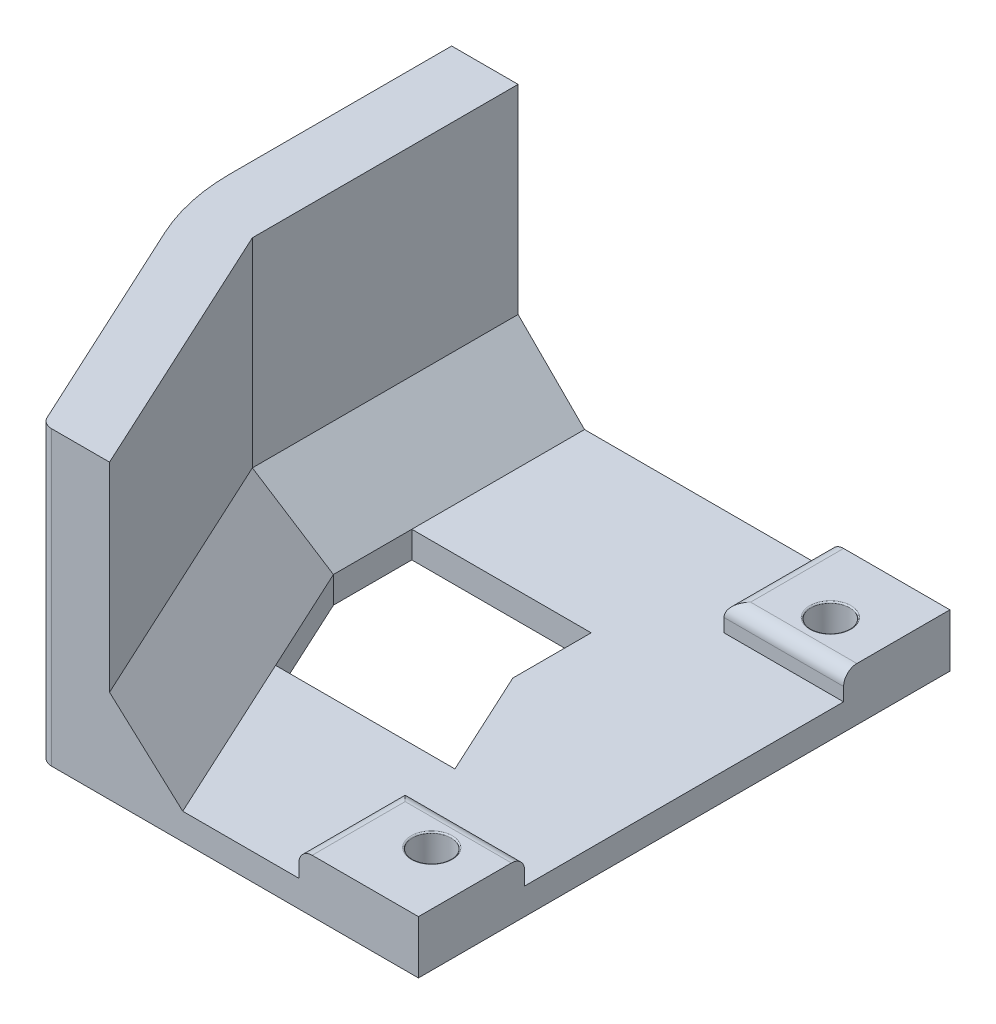
ISO-10303-21;
HEADER;
FILE_DESCRIPTION(('STEP AP214'),'2;1');
FILE_NAME('part.step','',(''),(''),'','','');
FILE_SCHEMA(('AUTOMOTIVE_DESIGN { 1 0 10303 214 1 1 1 1 }'));
ENDSEC;
DATA;
#1=APPLICATION_CONTEXT('core data for automotive mechanical design processes');
#2=APPLICATION_PROTOCOL_DEFINITION('international standard','automotive_design',2000,#1);
#3=PRODUCT_CONTEXT('',#1,'mechanical');
#4=PRODUCT('Part','Part','',(#3));
#5=PRODUCT_RELATED_PRODUCT_CATEGORY('part','',(#4));
#6=PRODUCT_DEFINITION_FORMATION('','',#4);
#7=PRODUCT_DEFINITION_CONTEXT('part definition',#1,'design');
#8=PRODUCT_DEFINITION('design','',#6,#7);
#9=PRODUCT_DEFINITION_SHAPE('','',#8);
#10=(LENGTH_UNIT() NAMED_UNIT(*) SI_UNIT(.MILLI.,.METRE.));
#11=(NAMED_UNIT(*) PLANE_ANGLE_UNIT() SI_UNIT($,.RADIAN.));
#12=(NAMED_UNIT(*) SI_UNIT($,.STERADIAN.) SOLID_ANGLE_UNIT());
#13=UNCERTAINTY_MEASURE_WITH_UNIT(LENGTH_MEASURE(1.E-05),#10,'distance_accuracy_value','');
#14=(GEOMETRIC_REPRESENTATION_CONTEXT(3) GLOBAL_UNCERTAINTY_ASSIGNED_CONTEXT((#13)) GLOBAL_UNIT_ASSIGNED_CONTEXT((#10,
#11,#12)) REPRESENTATION_CONTEXT('',''));
#15=CARTESIAN_POINT('',(0.,0.,0.));
#16=DIRECTION('',(0.,0.,1.));
#17=DIRECTION('',(1.,0.,0.));
#18=AXIS2_PLACEMENT_3D('',#15,#16,#17);
#19=CARTESIAN_POINT('',(0.,8.,0.));
#20=DIRECTION('',(0.,-1.,0.));
#21=DIRECTION('',(0.,0.,-1.));
#22=AXIS2_PLACEMENT_3D('',#19,#20,#21);
#23=PLANE('',#22);
#24=CARTESIAN_POINT('',(10.,8.,-70.));
#25=DIRECTION('',(0.,-1.,0.));
#26=DIRECTION('',(0.,0.,-1.));
#27=AXIS2_PLACEMENT_3D('',#24,#25,#26);
#28=CIRCLE('',#27,3.1);
#29=CARTESIAN_POINT('',(10.,8.,-73.1));
#30=VERTEX_POINT('',#29);
#31=EDGE_CURVE('E320',#30,#30,#28,.T.);
#32=ORIENTED_EDGE('',*,*,#31,.T.);
#33=EDGE_LOOP('',(#32));
#34=FACE_BOUND('',#33,.T.);
#35=DIRECTION('',(-1.,0.,0.));
#36=VECTOR('',#35,1.);
#37=CARTESIAN_POINT('',(20.,8.,-80.));
#38=LINE('',#37,#36);
#39=CARTESIAN_POINT('',(18.,8.,-80.));
#40=VERTEX_POINT('',#39);
#41=CARTESIAN_POINT('',(2.,8.,-80.));
#42=VERTEX_POINT('',#41);
#43=EDGE_CURVE('E400',#40,#42,#38,.T.);
#44=ORIENTED_EDGE('',*,*,#43,.T.);
#45=DIRECTION('',(0.,0.,1.));
#46=VECTOR('',#45,1.);
#47=CARTESIAN_POINT('',(2.00000000000001,8.,0.));
#48=LINE('',#47,#46);
#49=CARTESIAN_POINT('',(2.,8.,-66.));
#50=VERTEX_POINT('',#49);
#51=EDGE_CURVE('E294',#42,#50,#48,.T.);
#52=ORIENTED_EDGE('',*,*,#51,.T.);
#53=DIRECTION('',(-1.,0.,0.));
#54=VECTOR('',#53,1.);
#55=CARTESIAN_POINT('',(0.,8.,-66.));
#56=LINE('',#55,#54);
#57=CARTESIAN_POINT('',(18.,8.,-66.));
#58=VERTEX_POINT('',#57);
#59=EDGE_CURVE('E292',#50,#58,#56,.F.);
#60=ORIENTED_EDGE('',*,*,#59,.T.);
#61=DIRECTION('',(0.,0.,1.));
#62=VECTOR('',#61,1.);
#63=CARTESIAN_POINT('',(18.,8.,-80.));
#64=LINE('',#63,#62);
#65=EDGE_CURVE('E483',#40,#58,#64,.T.);
#66=ORIENTED_EDGE('',*,*,#65,.F.);
#67=EDGE_LOOP('',(#44,#52,#60,#66));
#68=FACE_BOUND('',#67,.T.);
#69=ADVANCED_FACE('F40',(#34,#68),#23,.F.);
#70=CARTESIAN_POINT('',(0.,8.,-80.));
#71=DIRECTION('',(1.,0.,0.));
#72=DIRECTION('',(0.,0.,-1.));
#73=AXIS2_PLACEMENT_3D('',#70,#71,#72);
#74=PLANE('',#73);
#75=DIRECTION('',(0.,1.,0.));
#76=VECTOR('',#75,1.);
#77=CARTESIAN_POINT('',(0.,-47.2640224719052,-64.));
#78=LINE('',#77,#76);
#79=CARTESIAN_POINT('',(0.,4.,-64.));
#80=VERTEX_POINT('',#79);
#81=CARTESIAN_POINT('',(0.,6.,-64.));
#82=VERTEX_POINT('',#81);
#83=EDGE_CURVE('E679',#80,#82,#78,.T.);
#84=ORIENTED_EDGE('',*,*,#83,.T.);
#85=DIRECTION('',(0.,0.,1.));
#86=VECTOR('',#85,1.);
#87=CARTESIAN_POINT('',(0.,6.,-80.));
#88=LINE('',#87,#86);
#89=CARTESIAN_POINT('',(0.,6.,-80.));
#90=VERTEX_POINT('',#89);
#91=EDGE_CURVE('E297',#82,#90,#88,.F.);
#92=ORIENTED_EDGE('',*,*,#91,.T.);
#93=DIRECTION('',(0.,-1.,0.));
#94=VECTOR('',#93,1.);
#95=CARTESIAN_POINT('',(0.,8.,-80.));
#96=LINE('',#95,#94);
#97=CARTESIAN_POINT('',(0.,4.,-80.));
#98=VERTEX_POINT('',#97);
#99=EDGE_CURVE('E396',#90,#98,#96,.T.);
#100=ORIENTED_EDGE('',*,*,#99,.T.);
#101=DIRECTION('',(0.,0.,1.));
#102=VECTOR('',#101,1.);
#103=CARTESIAN_POINT('',(0.,4.,-80.));
#104=LINE('',#103,#102);
#105=EDGE_CURVE('E403',#98,#80,#104,.T.);
#106=ORIENTED_EDGE('',*,*,#105,.T.);
#107=EDGE_LOOP('',(#84,#92,#100,#106));
#108=FACE_BOUND('',#107,.T.);
#109=ADVANCED_FACE('F344',(#108),#74,.F.);
#110=CARTESIAN_POINT('',(0.,4.,-80.));
#111=DIRECTION('',(0.,0.,1.));
#112=DIRECTION('',(1.,0.,0.));
#113=AXIS2_PLACEMENT_3D('',#110,#111,#112);
#114=PLANE('',#113);
#115=ORIENTED_EDGE('',*,*,#99,.F.);
#116=CARTESIAN_POINT('',(2.,6.,-80.));
#117=DIRECTION('',(0.,0.,1.));
#118=DIRECTION('',(1.,0.,0.));
#119=AXIS2_PLACEMENT_3D('',#116,#117,#118);
#120=CIRCLE('',#119,2.);
#121=EDGE_CURVE('E299',#90,#42,#120,.F.);
#122=ORIENTED_EDGE('',*,*,#121,.T.);
#123=ORIENTED_EDGE('',*,*,#43,.F.);
#124=DIRECTION('',(0.,1.,0.));
#125=VECTOR('',#124,1.);
#126=CARTESIAN_POINT('',(18.,0.,-80.));
#127=LINE('',#126,#125);
#128=CARTESIAN_POINT('',(18.,0.,-80.));
#129=VERTEX_POINT('',#128);
#130=EDGE_CURVE('E501',#129,#40,#127,.T.);
#131=ORIENTED_EDGE('',*,*,#130,.F.);
#132=DIRECTION('',(-1.,0.,0.));
#133=VECTOR('',#132,1.);
#134=CARTESIAN_POINT('',(0.,0.,-80.));
#135=LINE('',#134,#133);
#136=CARTESIAN_POINT('',(-57.,0.,-80.));
#137=VERTEX_POINT('',#136);
#138=EDGE_CURVE('E427',#129,#137,#135,.T.);
#139=ORIENTED_EDGE('',*,*,#138,.T.);
#140=DIRECTION('',(0.,-1.,0.));
#141=VECTOR('',#140,1.);
#142=CARTESIAN_POINT('',(-57.,4.,-80.));
#143=LINE('',#142,#141);
#144=CARTESIAN_POINT('',(-57.,44.,-80.));
#145=VERTEX_POINT('',#144);
#146=EDGE_CURVE('E434',#145,#137,#143,.T.);
#147=ORIENTED_EDGE('',*,*,#146,.F.);
#148=DIRECTION('',(-1.,0.,0.));
#149=VECTOR('',#148,1.);
#150=CARTESIAN_POINT('',(-57.,44.,-80.));
#151=LINE('',#150,#149);
#152=CARTESIAN_POINT('',(-47.,44.,-80.));
#153=VERTEX_POINT('',#152);
#154=EDGE_CURVE('E415',#153,#145,#151,.T.);
#155=ORIENTED_EDGE('',*,*,#154,.F.);
#156=DIRECTION('',(0.,-1.,0.));
#157=VECTOR('',#156,1.);
#158=CARTESIAN_POINT('',(-47.,44.,-80.));
#159=LINE('',#158,#157);
#160=CARTESIAN_POINT('',(-47.,14.0000000000001,-80.));
#161=VERTEX_POINT('',#160);
#162=EDGE_CURVE('E418',#153,#161,#159,.T.);
#163=ORIENTED_EDGE('',*,*,#162,.T.);
#164=DIRECTION('',(0.707106781186545,-0.70710678118655,0.));
#165=VECTOR('',#164,1.);
#166=CARTESIAN_POINT('',(-18.5000000000002,-14.5,-80.));
#167=LINE('',#166,#165);
#168=CARTESIAN_POINT('',(-37.,4.,-80.));
#169=VERTEX_POINT('',#168);
#170=EDGE_CURVE('E260',#161,#169,#167,.T.);
#171=ORIENTED_EDGE('',*,*,#170,.T.);
#172=DIRECTION('',(-1.,0.,0.));
#173=VECTOR('',#172,1.);
#174=CARTESIAN_POINT('',(0.,4.,-80.));
#175=LINE('',#174,#173);
#176=EDGE_CURVE('E428',#98,#169,#175,.T.);
#177=ORIENTED_EDGE('',*,*,#176,.F.);
#178=EDGE_LOOP('',(#115,#122,#123,#131,#139,#147,#155,#163,#171,#177));
#179=FACE_BOUND('',#178,.T.);
#180=ADVANCED_FACE('F351',(#179),#114,.F.);
#181=CARTESIAN_POINT('',(0.,4.,0.));
#182=DIRECTION('',(0.,0.,-1.));
#183=DIRECTION('',(-1.,0.,0.));
#184=AXIS2_PLACEMENT_3D('',#181,#182,#183);
#185=PLANE('',#184);
#186=DIRECTION('',(1.,0.,0.));
#187=VECTOR('',#186,1.);
#188=CARTESIAN_POINT('',(20.,8.,0.));
#189=LINE('',#188,#187);
#190=CARTESIAN_POINT('',(2.00000000000001,8.,0.));
#191=VERTEX_POINT('',#190);
#192=CARTESIAN_POINT('',(18.,8.,0.));
#193=VERTEX_POINT('',#192);
#194=EDGE_CURVE('E389',#191,#193,#189,.T.);
#195=ORIENTED_EDGE('',*,*,#194,.F.);
#196=CARTESIAN_POINT('',(2.00000000000001,6.,0.));
#197=DIRECTION('',(0.,0.,-1.));
#198=DIRECTION('',(-1.,0.,0.));
#199=AXIS2_PLACEMENT_3D('',#196,#197,#198);
#200=CIRCLE('',#199,2.);
#201=CARTESIAN_POINT('',(0.,6.,0.));
#202=VERTEX_POINT('',#201);
#203=EDGE_CURVE('E282',#191,#202,#200,.F.);
#204=ORIENTED_EDGE('',*,*,#203,.T.);
#205=DIRECTION('',(0.,-1.,0.));
#206=VECTOR('',#205,1.);
#207=CARTESIAN_POINT('',(0.,8.,0.));
#208=LINE('',#207,#206);
#209=CARTESIAN_POINT('',(0.,4.,0.));
#210=VERTEX_POINT('',#209);
#211=EDGE_CURVE('E387',#202,#210,#208,.T.);
#212=ORIENTED_EDGE('',*,*,#211,.T.);
#213=DIRECTION('',(1.,0.,0.));
#214=VECTOR('',#213,1.);
#215=CARTESIAN_POINT('',(0.,4.,0.));
#216=LINE('',#215,#214);
#217=CARTESIAN_POINT('',(-17.4822586252899,4.,0.));
#218=VERTEX_POINT('',#217);
#219=EDGE_CURVE('E431',#218,#210,#216,.T.);
#220=ORIENTED_EDGE('',*,*,#219,.F.);
#221=DIRECTION('',(-0.740479365120105,0.672079094922112,0.));
#222=VECTOR('',#221,1.);
#223=CARTESIAN_POINT('',(-7.89656681500855,-4.70023309158822,0.));
#224=LINE('',#223,#222);
#225=CARTESIAN_POINT('',(-28.5,14.0000000000001,0.));
#226=VERTEX_POINT('',#225);
#227=EDGE_CURVE('E250',#218,#226,#224,.T.);
#228=ORIENTED_EDGE('',*,*,#227,.T.);
#229=DIRECTION('',(0.,-1.,0.));
#230=VECTOR('',#229,1.);
#231=CARTESIAN_POINT('',(-28.5,44.,0.));
#232=LINE('',#231,#230);
#233=CARTESIAN_POINT('',(-28.5,44.,0.));
#234=VERTEX_POINT('',#233);
#235=EDGE_CURVE('E424',#234,#226,#232,.T.);
#236=ORIENTED_EDGE('',*,*,#235,.F.);
#237=DIRECTION('',(1.,0.,0.));
#238=VECTOR('',#237,1.);
#239=CARTESIAN_POINT('',(-28.5,44.,0.));
#240=LINE('',#239,#238);
#241=CARTESIAN_POINT('',(-37.221451725058,44.,0.));
#242=VERTEX_POINT('',#241);
#243=EDGE_CURVE('E409',#242,#234,#240,.T.);
#244=ORIENTED_EDGE('',*,*,#243,.F.);
#245=DIRECTION('',(0.,-1.,0.));
#246=VECTOR('',#245,1.);
#247=CARTESIAN_POINT('',(-37.221451725058,4.,0.));
#248=LINE('',#247,#246);
#249=CARTESIAN_POINT('',(-37.221451725058,0.,0.));
#250=VERTEX_POINT('',#249);
#251=EDGE_CURVE('E279',#242,#250,#248,.T.);
#252=ORIENTED_EDGE('',*,*,#251,.T.);
#253=DIRECTION('',(1.,0.,0.));
#254=VECTOR('',#253,1.);
#255=CARTESIAN_POINT('',(0.,0.,0.));
#256=LINE('',#255,#254);
#257=CARTESIAN_POINT('',(18.,0.,0.));
#258=VERTEX_POINT('',#257);
#259=EDGE_CURVE('E432',#250,#258,#256,.T.);
#260=ORIENTED_EDGE('',*,*,#259,.T.);
#261=DIRECTION('',(0.,-1.,0.));
#262=VECTOR('',#261,1.);
#263=CARTESIAN_POINT('',(18.,8.,0.));
#264=LINE('',#263,#262);
#265=EDGE_CURVE('E502',#193,#258,#264,.T.);
#266=ORIENTED_EDGE('',*,*,#265,.F.);
#267=EDGE_LOOP('',(#195,#204,#212,#220,#228,#236,#244,#252,#260,#266));
#268=FACE_BOUND('',#267,.T.);
#269=ADVANCED_FACE('F367',(#268),#185,.F.);
#270=CARTESIAN_POINT('',(0.,0.,0.));
#271=DIRECTION('',(0.,1.,0.));
#272=DIRECTION('',(0.,0.,1.));
#273=AXIS2_PLACEMENT_3D('',#270,#271,#272);
#274=PLANE('',#273);
#275=DIRECTION('',(1.,0.,0.));
#276=VECTOR('',#275,1.);
#277=CARTESIAN_POINT('',(-37.,0.,-54.));
#278=LINE('',#277,#276);
#279=CARTESIAN_POINT('',(-37.,0.,-54.));
#280=VERTEX_POINT('',#279);
#281=CARTESIAN_POINT('',(-10.,0.,-54.));
#282=VERTEX_POINT('',#281);
#283=EDGE_CURVE('E638',#280,#282,#278,.T.);
#284=ORIENTED_EDGE('',*,*,#283,.F.);
#285=DIRECTION('',(0.,0.,-1.));
#286=VECTOR('',#285,1.);
#287=CARTESIAN_POINT('',(-37.,0.,-42.2005218912652));
#288=LINE('',#287,#286);
#289=CARTESIAN_POINT('',(-37.,0.,-42.2005218912652));
#290=VERTEX_POINT('',#289);
#291=EDGE_CURVE('E647',#290,#280,#288,.T.);
#292=ORIENTED_EDGE('',*,*,#291,.F.);
#293=DIRECTION('',(-0.419777506360433,0.,-0.907627040779315));
#294=VECTOR('',#293,1.);
#295=CARTESIAN_POINT('',(-37.,0.,-42.2005218912652));
#296=LINE('',#295,#294);
#297=CARTESIAN_POINT('',(-29.5072586252899,0.,-26.));
#298=VERTEX_POINT('',#297);
#299=EDGE_CURVE('E663',#298,#290,#296,.T.);
#300=ORIENTED_EDGE('',*,*,#299,.F.);
#301=DIRECTION('',(-1.,0.,0.));
#302=VECTOR('',#301,1.);
#303=CARTESIAN_POINT('',(-29.5072586252899,0.,-26.));
#304=LINE('',#303,#302);
#305=CARTESIAN_POINT('',(-2.50725862528985,0.,-26.));
#306=VERTEX_POINT('',#305);
#307=EDGE_CURVE('E222',#306,#298,#304,.T.);
#308=ORIENTED_EDGE('',*,*,#307,.F.);
#309=DIRECTION('',(0.419777506360434,0.,0.907627040779315));
#310=VECTOR('',#309,1.);
#311=CARTESIAN_POINT('',(-2.50725862528985,0.,-26.));
#312=LINE('',#311,#310);
#313=CARTESIAN_POINT('',(-10.,0.,-42.2005218912652));
#314=VERTEX_POINT('',#313);
#315=EDGE_CURVE('E657',#314,#306,#312,.T.);
#316=ORIENTED_EDGE('',*,*,#315,.F.);
#317=DIRECTION('',(0.,0.,1.));
#318=VECTOR('',#317,1.);
#319=CARTESIAN_POINT('',(-10.,0.,-42.2005218912652));
#320=LINE('',#319,#318);
#321=EDGE_CURVE('E648',#282,#314,#320,.T.);
#322=ORIENTED_EDGE('',*,*,#321,.F.);
#323=EDGE_LOOP('',(#284,#292,#300,#308,#316,#322));
#324=FACE_BOUND('',#323,.T.);
#325=CARTESIAN_POINT('',(10.,0.,-9.99999999999999));
#326=DIRECTION('',(0.,1.,0.));
#327=DIRECTION('',(0.,0.,-1.));
#328=AXIS2_PLACEMENT_3D('',#325,#326,#327);
#329=CIRCLE('',#328,1.45);
#330=CARTESIAN_POINT('',(10.,0.,-11.45));
#331=VERTEX_POINT('',#330);
#332=EDGE_CURVE('E467',#331,#331,#329,.T.);
#333=ORIENTED_EDGE('',*,*,#332,.T.);
#334=EDGE_LOOP('',(#333));
#335=FACE_BOUND('',#334,.T.);
#336=CARTESIAN_POINT('',(10.,0.,-70.));
#337=DIRECTION('',(0.,1.,0.));
#338=DIRECTION('',(0.,0.,1.));
#339=AXIS2_PLACEMENT_3D('',#336,#337,#338);
#340=CIRCLE('',#339,1.45);
#341=CARTESIAN_POINT('',(10.,0.,-68.55));
#342=VERTEX_POINT('',#341);
#343=EDGE_CURVE('E464',#342,#342,#340,.T.);
#344=ORIENTED_EDGE('',*,*,#343,.T.);
#345=EDGE_LOOP('',(#344));
#346=FACE_BOUND('',#345,.T.);
#347=ORIENTED_EDGE('',*,*,#259,.F.);
#348=CARTESIAN_POINT('',(-37.221451725058,0.,-2.));
#349=DIRECTION('',(0.,1.,0.));
#350=DIRECTION('',(0.,0.,1.));
#351=AXIS2_PLACEMENT_3D('',#348,#349,#350);
#352=CIRCLE('',#351,2.);
#353=CARTESIAN_POINT('',(-39.0367058066166,0.,-1.16044498727913));
#354=VERTEX_POINT('',#353);
#355=EDGE_CURVE('E63',#250,#354,#352,.F.);
#356=ORIENTED_EDGE('',*,*,#355,.T.);
#357=DIRECTION('',(-0.419777506360433,0.,-0.907627040779315));
#358=VECTOR('',#357,1.);
#359=CARTESIAN_POINT('',(-31.7157935384219,0.,14.6685545115201));
#360=LINE('',#359,#358);
#361=CARTESIAN_POINT('',(-54.2288112233795,0.,-34.0082404829826));
#362=VERTEX_POINT('',#361);
#363=EDGE_CURVE('E442',#354,#362,#360,.T.);
#364=ORIENTED_EDGE('',*,*,#363,.T.);
#365=CARTESIAN_POINT('',(-27.,0.,-46.6015656737956));
#366=DIRECTION('',(0.,1.,0.));
#367=DIRECTION('',(0.,0.,1.));
#368=AXIS2_PLACEMENT_3D('',#365,#366,#367);
#369=CIRCLE('',#368,30.);
#370=CARTESIAN_POINT('',(-57.,0.,-46.6015656737956));
#371=VERTEX_POINT('',#370);
#372=EDGE_CURVE('E268',#362,#371,#369,.F.);
#373=ORIENTED_EDGE('',*,*,#372,.T.);
#374=DIRECTION('',(0.,0.,1.));
#375=VECTOR('',#374,1.);
#376=CARTESIAN_POINT('',(-57.,0.,0.));
#377=LINE('',#376,#375);
#378=EDGE_CURVE('E436',#137,#371,#377,.T.);
#379=ORIENTED_EDGE('',*,*,#378,.F.);
#380=ORIENTED_EDGE('',*,*,#138,.F.);
#381=DIRECTION('',(0.,0.,-1.));
#382=VECTOR('',#381,1.);
#383=CARTESIAN_POINT('',(18.,0.,0.));
#384=LINE('',#383,#382);
#385=EDGE_CURVE('E505',#258,#129,#384,.T.);
#386=ORIENTED_EDGE('',*,*,#385,.F.);
#387=EDGE_LOOP('',(#347,#356,#364,#373,#379,#380,#386));
#388=FACE_BOUND('',#387,.T.);
#389=ADVANCED_FACE('F359',(#324,#335,#346,#388),#274,.F.);
#390=CARTESIAN_POINT('',(10.,8.,-9.99999999999999));
#391=DIRECTION('',(0.,-1.,0.));
#392=DIRECTION('',(0.,0.,-1.));
#393=AXIS2_PLACEMENT_3D('',#390,#391,#392);
#394=CIRCLE('',#393,3.1);
#395=CARTESIAN_POINT('',(10.,8.,-13.1));
#396=VERTEX_POINT('',#395);
#397=EDGE_CURVE('E12',#396,#396,#394,.T.);
#398=ORIENTED_EDGE('',*,*,#397,.T.);
#399=EDGE_LOOP('',(#398));
#400=FACE_BOUND('',#399,.T.);
#401=DIRECTION('',(1.,0.,0.));
#402=VECTOR('',#401,1.);
#403=CARTESIAN_POINT('',(0.,8.,-14.));
#404=LINE('',#403,#402);
#405=CARTESIAN_POINT('',(18.,8.,-14.));
#406=VERTEX_POINT('',#405);
#407=CARTESIAN_POINT('',(2.00000000000001,8.,-14.));
#408=VERTEX_POINT('',#407);
#409=EDGE_CURVE('E274',#406,#408,#404,.F.);
#410=ORIENTED_EDGE('',*,*,#409,.T.);
#411=DIRECTION('',(0.,0.,1.));
#412=VECTOR('',#411,1.);
#413=CARTESIAN_POINT('',(2.00000000000001,8.,0.));
#414=LINE('',#413,#412);
#415=EDGE_CURVE('E276',#408,#191,#414,.T.);
#416=ORIENTED_EDGE('',*,*,#415,.T.);
#417=ORIENTED_EDGE('',*,*,#194,.T.);
#418=EDGE_CURVE('E377',#406,#193,#64,.T.);
#419=ORIENTED_EDGE('',*,*,#418,.F.);
#420=EDGE_LOOP('',(#410,#416,#417,#419));
#421=FACE_BOUND('',#420,.T.);
#422=ADVANCED_FACE('F347',(#400,#421),#23,.F.);
#423=CARTESIAN_POINT('',(10.,8.,-9.99999999999999));
#424=DIRECTION('',(0.,-1.,0.));
#425=DIRECTION('',(0.,0.,-1.));
#426=AXIS2_PLACEMENT_3D('',#423,#424,#425);
#427=CYLINDRICAL_SURFACE('',#426,1.45);
#428=CARTESIAN_POINT('',(10.,1.8,-9.99999999999999));
#429=DIRECTION('',(0.,1.,0.));
#430=DIRECTION('',(0.,0.,1.));
#431=AXIS2_PLACEMENT_3D('',#428,#429,#430);
#432=CIRCLE('',#431,1.45);
#433=CARTESIAN_POINT('',(10.,1.8,-8.54999999999999));
#434=VERTEX_POINT('',#433);
#435=EDGE_CURVE('E323',#434,#434,#432,.T.);
#436=ORIENTED_EDGE('',*,*,#435,.T.);
#437=EDGE_LOOP('',(#436));
#438=FACE_BOUND('',#437,.T.);
#439=ORIENTED_EDGE('',*,*,#332,.F.);
#440=EDGE_LOOP('',(#439));
#441=FACE_BOUND('',#440,.T.);
#442=ADVANCED_FACE('F358',(#438,#441),#427,.F.);
#443=CARTESIAN_POINT('',(10.,8.,-70.));
#444=DIRECTION('',(0.,-1.,0.));
#445=DIRECTION('',(0.,0.,-1.));
#446=AXIS2_PLACEMENT_3D('',#443,#444,#445);
#447=CYLINDRICAL_SURFACE('',#446,1.45);
#448=CARTESIAN_POINT('',(10.,1.8,-70.));
#449=DIRECTION('',(0.,1.,0.));
#450=DIRECTION('',(0.,0.,1.));
#451=AXIS2_PLACEMENT_3D('',#448,#449,#450);
#452=CIRCLE('',#451,1.45);
#453=CARTESIAN_POINT('',(10.,1.8,-68.55));
#454=VERTEX_POINT('',#453);
#455=EDGE_CURVE('E307',#454,#454,#452,.T.);
#456=ORIENTED_EDGE('',*,*,#455,.T.);
#457=EDGE_LOOP('',(#456));
#458=FACE_BOUND('',#457,.T.);
#459=ORIENTED_EDGE('',*,*,#343,.F.);
#460=EDGE_LOOP('',(#459));
#461=FACE_BOUND('',#460,.T.);
#462=ADVANCED_FACE('F365',(#458,#461),#447,.F.);
#463=CARTESIAN_POINT('',(0.,4.,0.));
#464=DIRECTION('',(0.,1.,0.));
#465=DIRECTION('',(0.,0.,1.));
#466=AXIS2_PLACEMENT_3D('',#463,#464,#465);
#467=PLANE('',#466);
#468=DIRECTION('',(1.,0.,0.));
#469=VECTOR('',#468,1.);
#470=CARTESIAN_POINT('',(-29.5072586252899,4.,-26.));
#471=LINE('',#470,#469);
#472=CARTESIAN_POINT('',(-29.5072586252899,4.,-26.));
#473=VERTEX_POINT('',#472);
#474=CARTESIAN_POINT('',(-2.50725862528985,4.,-26.));
#475=VERTEX_POINT('',#474);
#476=EDGE_CURVE('E219',#473,#475,#471,.T.);
#477=ORIENTED_EDGE('',*,*,#476,.F.);
#478=DIRECTION('',(0.419777506360433,0.,0.907627040779315));
#479=VECTOR('',#478,1.);
#480=CARTESIAN_POINT('',(-14.4016546790906,4.,6.66076528907942));
#481=LINE('',#480,#479);
#482=EDGE_CURVE('E241',#473,#218,#481,.T.);
#483=ORIENTED_EDGE('',*,*,#482,.T.);
#484=ORIENTED_EDGE('',*,*,#219,.T.);
#485=CARTESIAN_POINT('',(0.,4.,-16.));
#486=VERTEX_POINT('',#485);
#487=EDGE_CURVE('E395',#486,#210,#104,.T.);
#488=ORIENTED_EDGE('',*,*,#487,.F.);
#489=DIRECTION('',(-1.,0.,0.));
#490=VECTOR('',#489,1.);
#491=CARTESIAN_POINT('',(0.,4.,-16.));
#492=LINE('',#491,#490);
#493=CARTESIAN_POINT('',(18.,4.,-16.));
#494=VERTEX_POINT('',#493);
#495=EDGE_CURVE('E462',#494,#486,#492,.T.);
#496=ORIENTED_EDGE('',*,*,#495,.F.);
#497=DIRECTION('',(0.,0.,1.));
#498=VECTOR('',#497,1.);
#499=CARTESIAN_POINT('',(18.,4.,-64.));
#500=LINE('',#499,#498);
#501=CARTESIAN_POINT('',(18.,4.,-64.));
#502=VERTEX_POINT('',#501);
#503=EDGE_CURVE('E675',#502,#494,#500,.T.);
#504=ORIENTED_EDGE('',*,*,#503,.F.);
#505=DIRECTION('',(1.,0.,0.));
#506=VECTOR('',#505,1.);
#507=CARTESIAN_POINT('',(0.,4.,-64.));
#508=LINE('',#507,#506);
#509=EDGE_CURVE('E678',#80,#502,#508,.T.);
#510=ORIENTED_EDGE('',*,*,#509,.F.);
#511=ORIENTED_EDGE('',*,*,#105,.F.);
#512=ORIENTED_EDGE('',*,*,#176,.T.);
#513=DIRECTION('',(0.,0.,1.));
#514=VECTOR('',#513,1.);
#515=CARTESIAN_POINT('',(-37.,4.,0.));
#516=LINE('',#515,#514);
#517=CARTESIAN_POINT('',(-37.,4.,-54.));
#518=VERTEX_POINT('',#517);
#519=EDGE_CURVE('E252',#169,#518,#516,.T.);
#520=ORIENTED_EDGE('',*,*,#519,.T.);
#521=DIRECTION('',(-1.,0.,0.));
#522=VECTOR('',#521,1.);
#523=CARTESIAN_POINT('',(-37.,4.,-54.));
#524=LINE('',#523,#522);
#525=CARTESIAN_POINT('',(-10.,4.,-54.));
#526=VERTEX_POINT('',#525);
#527=EDGE_CURVE('E667',#526,#518,#524,.T.);
#528=ORIENTED_EDGE('',*,*,#527,.F.);
#529=DIRECTION('',(0.,0.,-1.));
#530=VECTOR('',#529,1.);
#531=CARTESIAN_POINT('',(-10.,4.,-42.2005218912652));
#532=LINE('',#531,#530);
#533=CARTESIAN_POINT('',(-10.,4.,-42.2005218912652));
#534=VERTEX_POINT('',#533);
#535=EDGE_CURVE('E651',#534,#526,#532,.T.);
#536=ORIENTED_EDGE('',*,*,#535,.F.);
#537=DIRECTION('',(-0.419777506360434,0.,-0.907627040779315));
#538=VECTOR('',#537,1.);
#539=CARTESIAN_POINT('',(-2.50725862528985,4.,-26.));
#540=LINE('',#539,#538);
#541=EDGE_CURVE('E245',#475,#534,#540,.T.);
#542=ORIENTED_EDGE('',*,*,#541,.F.);
#543=EDGE_LOOP('',(#477,#483,#484,#488,#496,#504,#510,#511,#512,#520,#528,#536,#542));
#544=FACE_BOUND('',#543,.T.);
#545=ADVANCED_FACE('F239',(#544),#467,.T.);
#546=CARTESIAN_POINT('',(-57.,4.,0.));
#547=DIRECTION('',(1.,0.,0.));
#548=DIRECTION('',(0.,0.,-1.));
#549=AXIS2_PLACEMENT_3D('',#546,#547,#548);
#550=PLANE('',#549);
#551=ORIENTED_EDGE('',*,*,#378,.T.);
#552=DIRECTION('',(0.,-1.,0.));
#553=VECTOR('',#552,1.);
#554=CARTESIAN_POINT('',(-57.,4.,-46.6015656737956));
#555=LINE('',#554,#553);
#556=CARTESIAN_POINT('',(-57.,44.,-46.6015656737956));
#557=VERTEX_POINT('',#556);
#558=EDGE_CURVE('E270',#371,#557,#555,.F.);
#559=ORIENTED_EDGE('',*,*,#558,.T.);
#560=DIRECTION('',(0.,0.,1.));
#561=VECTOR('',#560,1.);
#562=CARTESIAN_POINT('',(-57.,44.,-80.));
#563=LINE('',#562,#561);
#564=EDGE_CURVE('E398',#145,#557,#563,.T.);
#565=ORIENTED_EDGE('',*,*,#564,.F.);
#566=ORIENTED_EDGE('',*,*,#146,.T.);
#567=EDGE_LOOP('',(#551,#559,#565,#566));
#568=FACE_BOUND('',#567,.T.);
#569=ADVANCED_FACE('F537',(#568),#550,.F.);
#570=CARTESIAN_POINT('',(-38.5,44.,0.));
#571=DIRECTION('',(0.907627040779315,0.,-0.419777506360433));
#572=DIRECTION('',(-0.419777506360433,0.,-0.907627040779315));
#573=AXIS2_PLACEMENT_3D('',#570,#571,#572);
#574=PLANE('',#573);
#575=ORIENTED_EDGE('',*,*,#363,.F.);
#576=DIRECTION('',(0.,-1.,0.));
#577=VECTOR('',#576,1.);
#578=CARTESIAN_POINT('',(-39.0367058066166,44.,-1.16044498727913));
#579=LINE('',#578,#577);
#580=CARTESIAN_POINT('',(-39.0367058066166,44.,-1.16044498727913));
#581=VERTEX_POINT('',#580);
#582=EDGE_CURVE('E55',#354,#581,#579,.F.);
#583=ORIENTED_EDGE('',*,*,#582,.T.);
#584=DIRECTION('',(0.419777506360433,0.,0.907627040779315));
#585=VECTOR('',#584,1.);
#586=CARTESIAN_POINT('',(-38.5,44.,0.));
#587=LINE('',#586,#585);
#588=CARTESIAN_POINT('',(-54.2288112233795,44.,-34.0082404829826));
#589=VERTEX_POINT('',#588);
#590=EDGE_CURVE('E407',#589,#581,#587,.T.);
#591=ORIENTED_EDGE('',*,*,#590,.F.);
#592=DIRECTION('',(0.,-1.,0.));
#593=VECTOR('',#592,1.);
#594=CARTESIAN_POINT('',(-54.2288112233795,44.,-34.0082404829826));
#595=LINE('',#594,#593);
#596=EDGE_CURVE('E262',#589,#362,#595,.T.);
#597=ORIENTED_EDGE('',*,*,#596,.T.);
#598=EDGE_LOOP('',(#575,#583,#591,#597));
#599=FACE_BOUND('',#598,.T.);
#600=ADVANCED_FACE('F585',(#599),#574,.F.);
#601=CARTESIAN_POINT('',(-47.,44.,-40.));
#602=DIRECTION('',(-0.907627040779315,0.,0.419777506360433));
#603=DIRECTION('',(0.419777506360433,0.,0.907627040779315));
#604=AXIS2_PLACEMENT_3D('',#601,#602,#603);
#605=PLANE('',#604);
#606=ORIENTED_EDGE('',*,*,#235,.T.);
#607=DIRECTION('',(-0.419777506360433,0.,-0.907627040779315));
#608=VECTOR('',#607,1.);
#609=CARTESIAN_POINT('',(-47.,14.0000000000001,-40.));
#610=LINE('',#609,#608);
#611=CARTESIAN_POINT('',(-47.,14.0000000000001,-40.));
#612=VERTEX_POINT('',#611);
#613=EDGE_CURVE('E255',#226,#612,#610,.T.);
#614=ORIENTED_EDGE('',*,*,#613,.T.);
#615=DIRECTION('',(0.,-1.,0.));
#616=VECTOR('',#615,1.);
#617=CARTESIAN_POINT('',(-47.,44.,-40.));
#618=LINE('',#617,#616);
#619=CARTESIAN_POINT('',(-47.,44.,-40.));
#620=VERTEX_POINT('',#619);
#621=EDGE_CURVE('E421',#620,#612,#618,.T.);
#622=ORIENTED_EDGE('',*,*,#621,.F.);
#623=DIRECTION('',(-0.419777506360433,0.,-0.907627040779315));
#624=VECTOR('',#623,1.);
#625=CARTESIAN_POINT('',(-47.,44.,-40.));
#626=LINE('',#625,#624);
#627=EDGE_CURVE('E411',#234,#620,#626,.T.);
#628=ORIENTED_EDGE('',*,*,#627,.F.);
#629=EDGE_LOOP('',(#606,#614,#622,#628));
#630=FACE_BOUND('',#629,.T.);
#631=ADVANCED_FACE('F446',(#630),#605,.F.);
#632=CARTESIAN_POINT('',(-47.,44.,-80.));
#633=DIRECTION('',(-1.,0.,0.));
#634=DIRECTION('',(0.,0.,1.));
#635=AXIS2_PLACEMENT_3D('',#632,#633,#634);
#636=PLANE('',#635);
#637=ORIENTED_EDGE('',*,*,#621,.T.);
#638=DIRECTION('',(0.,0.,-1.));
#639=VECTOR('',#638,1.);
#640=CARTESIAN_POINT('',(-47.,14.0000000000001,-80.));
#641=LINE('',#640,#639);
#642=EDGE_CURVE('E251',#612,#161,#641,.T.);
#643=ORIENTED_EDGE('',*,*,#642,.T.);
#644=ORIENTED_EDGE('',*,*,#162,.F.);
#645=DIRECTION('',(0.,0.,-1.));
#646=VECTOR('',#645,1.);
#647=CARTESIAN_POINT('',(-47.,44.,-80.));
#648=LINE('',#647,#646);
#649=EDGE_CURVE('E413',#620,#153,#648,.T.);
#650=ORIENTED_EDGE('',*,*,#649,.F.);
#651=EDGE_LOOP('',(#637,#643,#644,#650));
#652=FACE_BOUND('',#651,.T.);
#653=ADVANCED_FACE('F451',(#652),#636,.F.);
#654=CARTESIAN_POINT('',(0.,44.,0.));
#655=DIRECTION('',(0.,-1.,0.));
#656=DIRECTION('',(0.,0.,-1.));
#657=AXIS2_PLACEMENT_3D('',#654,#655,#656);
#658=PLANE('',#657);
#659=ORIENTED_EDGE('',*,*,#590,.T.);
#660=CARTESIAN_POINT('',(-37.221451725058,44.,-2.));
#661=DIRECTION('',(0.,-1.,0.));
#662=DIRECTION('',(0.,0.,-1.));
#663=AXIS2_PLACEMENT_3D('',#660,#661,#662);
#664=CIRCLE('',#663,2.);
#665=EDGE_CURVE('E305',#581,#242,#664,.F.);
#666=ORIENTED_EDGE('',*,*,#665,.T.);
#667=ORIENTED_EDGE('',*,*,#243,.T.);
#668=ORIENTED_EDGE('',*,*,#627,.T.);
#669=ORIENTED_EDGE('',*,*,#649,.T.);
#670=ORIENTED_EDGE('',*,*,#154,.T.);
#671=ORIENTED_EDGE('',*,*,#564,.T.);
#672=CARTESIAN_POINT('',(-27.,44.,-46.6015656737956));
#673=DIRECTION('',(0.,-1.,0.));
#674=DIRECTION('',(0.,0.,-1.));
#675=AXIS2_PLACEMENT_3D('',#672,#673,#674);
#676=CIRCLE('',#675,30.);
#677=EDGE_CURVE('E272',#557,#589,#676,.F.);
#678=ORIENTED_EDGE('',*,*,#677,.T.);
#679=EDGE_LOOP('',(#659,#666,#667,#668,#669,#670,#671,#678));
#680=FACE_BOUND('',#679,.T.);
#681=ADVANCED_FACE('F456',(#680),#658,.F.);
#682=ORIENTED_EDGE('',*,*,#211,.F.);
#683=DIRECTION('',(0.,0.,1.));
#684=VECTOR('',#683,1.);
#685=CARTESIAN_POINT('',(0.,6.,-80.));
#686=LINE('',#685,#684);
#687=CARTESIAN_POINT('',(0.,6.,-16.));
#688=VERTEX_POINT('',#687);
#689=EDGE_CURVE('E284',#202,#688,#686,.F.);
#690=ORIENTED_EDGE('',*,*,#689,.T.);
#691=DIRECTION('',(0.,1.,0.));
#692=VECTOR('',#691,1.);
#693=CARTESIAN_POINT('',(0.,-47.2640224719052,-16.));
#694=LINE('',#693,#692);
#695=EDGE_CURVE('E674',#486,#688,#694,.T.);
#696=ORIENTED_EDGE('',*,*,#695,.F.);
#697=ORIENTED_EDGE('',*,*,#487,.T.);
#698=EDGE_LOOP('',(#682,#690,#696,#697));
#699=FACE_BOUND('',#698,.T.);
#700=ADVANCED_FACE('F354',(#699),#74,.F.);
#701=CARTESIAN_POINT('',(10.,2.,-70.));
#702=DIRECTION('',(0.,1.,0.));
#703=DIRECTION('',(0.,0.,1.));
#704=AXIS2_PLACEMENT_3D('',#701,#702,#703);
#705=CYLINDRICAL_SURFACE('',#704,2.9);
#706=CARTESIAN_POINT('',(10.,7.8,-70.));
#707=DIRECTION('',(0.,-1.,0.));
#708=DIRECTION('',(0.,0.,-1.));
#709=AXIS2_PLACEMENT_3D('',#706,#707,#708);
#710=CIRCLE('',#709,2.9);
#711=CARTESIAN_POINT('',(10.,7.8,-72.9));
#712=VERTEX_POINT('',#711);
#713=EDGE_CURVE('E317',#712,#712,#710,.F.);
#714=ORIENTED_EDGE('',*,*,#713,.T.);
#715=EDGE_LOOP('',(#714));
#716=FACE_BOUND('',#715,.T.);
#717=CARTESIAN_POINT('',(10.,2.,-70.));
#718=DIRECTION('',(0.,1.,0.));
#719=DIRECTION('',(0.,0.,1.));
#720=AXIS2_PLACEMENT_3D('',#717,#718,#719);
#721=CIRCLE('',#720,2.9);
#722=CARTESIAN_POINT('',(10.,2.,-67.1));
#723=VERTEX_POINT('',#722);
#724=EDGE_CURVE('E472',#723,#723,#721,.T.);
#725=ORIENTED_EDGE('',*,*,#724,.F.);
#726=EDGE_LOOP('',(#725));
#727=FACE_BOUND('',#726,.T.);
#728=ADVANCED_FACE('F527',(#716,#727),#705,.F.);
#729=CARTESIAN_POINT('',(10.,2.,-70.));
#730=DIRECTION('',(0.,1.,0.));
#731=DIRECTION('',(0.,0.,1.));
#732=AXIS2_PLACEMENT_3D('',#729,#730,#731);
#733=PLANE('',#732);
#734=CARTESIAN_POINT('',(10.,2.,-70.));
#735=DIRECTION('',(0.,1.,0.));
#736=DIRECTION('',(0.,0.,1.));
#737=AXIS2_PLACEMENT_3D('',#734,#735,#736);
#738=CIRCLE('',#737,1.65);
#739=CARTESIAN_POINT('',(10.,2.,-68.35));
#740=VERTEX_POINT('',#739);
#741=EDGE_CURVE('E314',#740,#740,#738,.F.);
#742=ORIENTED_EDGE('',*,*,#741,.T.);
#743=EDGE_LOOP('',(#742));
#744=FACE_BOUND('',#743,.T.);
#745=ORIENTED_EDGE('',*,*,#724,.T.);
#746=EDGE_LOOP('',(#745));
#747=FACE_BOUND('',#746,.T.);
#748=ADVANCED_FACE('F519',(#744,#747),#733,.T.);
#749=CARTESIAN_POINT('',(10.,2.,-9.99999999999999));
#750=DIRECTION('',(0.,1.,0.));
#751=DIRECTION('',(0.,0.,1.));
#752=AXIS2_PLACEMENT_3D('',#749,#750,#751);
#753=CYLINDRICAL_SURFACE('',#752,2.9);
#754=CARTESIAN_POINT('',(10.,7.8,-9.99999999999999));
#755=DIRECTION('',(0.,-1.,0.));
#756=DIRECTION('',(0.,0.,-1.));
#757=AXIS2_PLACEMENT_3D('',#754,#755,#756);
#758=CIRCLE('',#757,2.9);
#759=CARTESIAN_POINT('',(10.,7.8,-12.9));
#760=VERTEX_POINT('',#759);
#761=EDGE_CURVE('E48',#760,#760,#758,.F.);
#762=ORIENTED_EDGE('',*,*,#761,.T.);
#763=EDGE_LOOP('',(#762));
#764=FACE_BOUND('',#763,.T.);
#765=CARTESIAN_POINT('',(10.,2.,-9.99999999999999));
#766=DIRECTION('',(0.,1.,0.));
#767=DIRECTION('',(0.,0.,1.));
#768=AXIS2_PLACEMENT_3D('',#765,#766,#767);
#769=CIRCLE('',#768,2.9);
#770=CARTESIAN_POINT('',(10.,2.,-7.1));
#771=VERTEX_POINT('',#770);
#772=EDGE_CURVE('E475',#771,#771,#769,.T.);
#773=ORIENTED_EDGE('',*,*,#772,.F.);
#774=EDGE_LOOP('',(#773));
#775=FACE_BOUND('',#774,.T.);
#776=ADVANCED_FACE('F331',(#764,#775),#753,.F.);
#777=CARTESIAN_POINT('',(10.,2.,-9.99999999999999));
#778=DIRECTION('',(0.,1.,0.));
#779=DIRECTION('',(0.,0.,1.));
#780=AXIS2_PLACEMENT_3D('',#777,#778,#779);
#781=PLANE('',#780);
#782=CARTESIAN_POINT('',(10.,2.,-9.99999999999999));
#783=DIRECTION('',(0.,1.,0.));
#784=DIRECTION('',(0.,0.,1.));
#785=AXIS2_PLACEMENT_3D('',#782,#783,#784);
#786=CIRCLE('',#785,1.65);
#787=CARTESIAN_POINT('',(10.,2.,-8.34999999999999));
#788=VERTEX_POINT('',#787);
#789=EDGE_CURVE('E326',#788,#788,#786,.F.);
#790=ORIENTED_EDGE('',*,*,#789,.T.);
#791=EDGE_LOOP('',(#790));
#792=FACE_BOUND('',#791,.T.);
#793=ORIENTED_EDGE('',*,*,#772,.T.);
#794=EDGE_LOOP('',(#793));
#795=FACE_BOUND('',#794,.T.);
#796=ADVANCED_FACE('F517',(#792,#795),#781,.T.);
#797=CARTESIAN_POINT('',(18.,0.,0.));
#798=DIRECTION('',(1.,0.,0.));
#799=DIRECTION('',(0.,0.,-1.));
#800=AXIS2_PLACEMENT_3D('',#797,#798,#799);
#801=PLANE('',#800);
#802=DIRECTION('',(0.,1.,0.));
#803=VECTOR('',#802,1.);
#804=CARTESIAN_POINT('',(18.,-47.2640224719052,-16.));
#805=LINE('',#804,#803);
#806=CARTESIAN_POINT('',(18.,6.,-16.));
#807=VERTEX_POINT('',#806);
#808=EDGE_CURVE('E685',#494,#807,#805,.T.);
#809=ORIENTED_EDGE('',*,*,#808,.T.);
#810=CARTESIAN_POINT('',(18.,6.,-14.));
#811=DIRECTION('',(1.,0.,0.));
#812=DIRECTION('',(0.,0.,-1.));
#813=AXIS2_PLACEMENT_3D('',#810,#811,#812);
#814=CIRCLE('',#813,2.);
#815=EDGE_CURVE('E290',#807,#406,#814,.T.);
#816=ORIENTED_EDGE('',*,*,#815,.T.);
#817=ORIENTED_EDGE('',*,*,#418,.T.);
#818=ORIENTED_EDGE('',*,*,#265,.T.);
#819=ORIENTED_EDGE('',*,*,#385,.T.);
#820=ORIENTED_EDGE('',*,*,#130,.T.);
#821=ORIENTED_EDGE('',*,*,#65,.T.);
#822=CARTESIAN_POINT('',(18.,6.,-66.));
#823=DIRECTION('',(1.,0.,0.));
#824=DIRECTION('',(0.,0.,-1.));
#825=AXIS2_PLACEMENT_3D('',#822,#823,#824);
#826=CIRCLE('',#825,2.);
#827=CARTESIAN_POINT('',(18.,6.,-64.));
#828=VERTEX_POINT('',#827);
#829=EDGE_CURVE('E288',#58,#828,#826,.T.);
#830=ORIENTED_EDGE('',*,*,#829,.T.);
#831=DIRECTION('',(0.,1.,0.));
#832=VECTOR('',#831,1.);
#833=CARTESIAN_POINT('',(18.,-47.2640224719052,-64.));
#834=LINE('',#833,#832);
#835=EDGE_CURVE('E683',#502,#828,#834,.T.);
#836=ORIENTED_EDGE('',*,*,#835,.F.);
#837=ORIENTED_EDGE('',*,*,#503,.T.);
#838=EDGE_LOOP('',(#809,#816,#817,#818,#819,#820,#821,#830,#836,#837));
#839=FACE_BOUND('',#838,.T.);
#840=ADVANCED_FACE('F498',(#839),#801,.T.);
#841=CARTESIAN_POINT('',(0.,-47.2640224719052,-64.));
#842=DIRECTION('',(0.,0.,-1.));
#843=DIRECTION('',(-1.,0.,0.));
#844=AXIS2_PLACEMENT_3D('',#841,#842,#843);
#845=PLANE('',#844);
#846=ORIENTED_EDGE('',*,*,#835,.T.);
#847=DIRECTION('',(-1.,0.,0.));
#848=VECTOR('',#847,1.);
#849=CARTESIAN_POINT('',(0.,6.,-64.));
#850=LINE('',#849,#848);
#851=EDGE_CURVE('E301',#828,#82,#850,.T.);
#852=ORIENTED_EDGE('',*,*,#851,.T.);
#853=ORIENTED_EDGE('',*,*,#83,.F.);
#854=ORIENTED_EDGE('',*,*,#509,.T.);
#855=EDGE_LOOP('',(#846,#852,#853,#854));
#856=FACE_BOUND('',#855,.T.);
#857=ADVANCED_FACE('F607',(#856),#845,.F.);
#858=CARTESIAN_POINT('',(0.,-47.2640224719052,-16.));
#859=DIRECTION('',(0.,0.,1.));
#860=DIRECTION('',(1.,0.,0.));
#861=AXIS2_PLACEMENT_3D('',#858,#859,#860);
#862=PLANE('',#861);
#863=ORIENTED_EDGE('',*,*,#695,.T.);
#864=DIRECTION('',(1.,0.,0.));
#865=VECTOR('',#864,1.);
#866=CARTESIAN_POINT('',(0.,6.,-16.));
#867=LINE('',#866,#865);
#868=EDGE_CURVE('E286',#688,#807,#867,.T.);
#869=ORIENTED_EDGE('',*,*,#868,.T.);
#870=ORIENTED_EDGE('',*,*,#808,.F.);
#871=ORIENTED_EDGE('',*,*,#495,.T.);
#872=EDGE_LOOP('',(#863,#869,#870,#871));
#873=FACE_BOUND('',#872,.T.);
#874=ADVANCED_FACE('F608',(#873),#862,.F.);
#875=CARTESIAN_POINT('',(-37.,-44.4268973431934,-42.2005218912652));
#876=DIRECTION('',(-1.,0.,0.));
#877=DIRECTION('',(0.,0.,1.));
#878=AXIS2_PLACEMENT_3D('',#875,#876,#877);
#879=PLANE('',#878);
#880=ORIENTED_EDGE('',*,*,#291,.T.);
#881=DIRECTION('',(0.,1.,0.));
#882=VECTOR('',#881,1.);
#883=CARTESIAN_POINT('',(-37.,-44.4268973431934,-54.));
#884=LINE('',#883,#882);
#885=EDGE_CURVE('E644',#280,#518,#884,.T.);
#886=ORIENTED_EDGE('',*,*,#885,.T.);
#887=DIRECTION('',(0.,0.,1.));
#888=VECTOR('',#887,1.);
#889=CARTESIAN_POINT('',(-37.,4.,-42.2005218912652));
#890=LINE('',#889,#888);
#891=CARTESIAN_POINT('',(-37.,4.,-42.2005218912652));
#892=VERTEX_POINT('',#891);
#893=EDGE_CURVE('E236',#518,#892,#890,.T.);
#894=ORIENTED_EDGE('',*,*,#893,.T.);
#895=DIRECTION('',(0.,1.,0.));
#896=VECTOR('',#895,1.);
#897=CARTESIAN_POINT('',(-37.,-44.4268973431934,-42.2005218912652));
#898=LINE('',#897,#896);
#899=EDGE_CURVE('E226',#290,#892,#898,.T.);
#900=ORIENTED_EDGE('',*,*,#899,.F.);
#901=EDGE_LOOP('',(#880,#886,#894,#900));
#902=FACE_BOUND('',#901,.T.);
#903=ADVANCED_FACE('F611',(#902),#879,.F.);
#904=CARTESIAN_POINT('',(-37.,-44.4268973431934,-54.));
#905=DIRECTION('',(0.,0.,-1.));
#906=DIRECTION('',(-1.,0.,0.));
#907=AXIS2_PLACEMENT_3D('',#904,#905,#906);
#908=PLANE('',#907);
#909=ORIENTED_EDGE('',*,*,#283,.T.);
#910=DIRECTION('',(0.,1.,0.));
#911=VECTOR('',#910,1.);
#912=CARTESIAN_POINT('',(-10.,-44.4268973431934,-54.));
#913=LINE('',#912,#911);
#914=EDGE_CURVE('E641',#282,#526,#913,.T.);
#915=ORIENTED_EDGE('',*,*,#914,.T.);
#916=ORIENTED_EDGE('',*,*,#527,.T.);
#917=ORIENTED_EDGE('',*,*,#885,.F.);
#918=EDGE_LOOP('',(#909,#915,#916,#917));
#919=FACE_BOUND('',#918,.T.);
#920=ADVANCED_FACE('F618',(#919),#908,.F.);
#921=CARTESIAN_POINT('',(-10.,-44.4268973431934,-42.2005218912652));
#922=DIRECTION('',(1.,0.,0.));
#923=DIRECTION('',(0.,0.,-1.));
#924=AXIS2_PLACEMENT_3D('',#921,#922,#923);
#925=PLANE('',#924);
#926=ORIENTED_EDGE('',*,*,#321,.T.);
#927=DIRECTION('',(0.,1.,0.));
#928=VECTOR('',#927,1.);
#929=CARTESIAN_POINT('',(-10.,-44.4268973431934,-42.2005218912652));
#930=LINE('',#929,#928);
#931=EDGE_CURVE('E653',#314,#534,#930,.T.);
#932=ORIENTED_EDGE('',*,*,#931,.T.);
#933=ORIENTED_EDGE('',*,*,#535,.T.);
#934=ORIENTED_EDGE('',*,*,#914,.F.);
#935=EDGE_LOOP('',(#926,#932,#933,#934));
#936=FACE_BOUND('',#935,.T.);
#937=ADVANCED_FACE('F627',(#936),#925,.F.);
#938=CARTESIAN_POINT('',(-2.50725862528985,-44.4268973431934,-26.));
#939=DIRECTION('',(0.907627040779315,0.,-0.419777506360434));
#940=DIRECTION('',(-0.419777506360434,0.,-0.907627040779315));
#941=AXIS2_PLACEMENT_3D('',#938,#939,#940);
#942=PLANE('',#941);
#943=ORIENTED_EDGE('',*,*,#315,.T.);
#944=DIRECTION('',(0.,1.,0.));
#945=VECTOR('',#944,1.);
#946=CARTESIAN_POINT('',(-2.50725862528985,-44.4268973431934,-26.));
#947=LINE('',#946,#945);
#948=EDGE_CURVE('E225',#306,#475,#947,.T.);
#949=ORIENTED_EDGE('',*,*,#948,.T.);
#950=ORIENTED_EDGE('',*,*,#541,.T.);
#951=ORIENTED_EDGE('',*,*,#931,.F.);
#952=EDGE_LOOP('',(#943,#949,#950,#951));
#953=FACE_BOUND('',#952,.T.);
#954=ADVANCED_FACE('F624',(#953),#942,.F.);
#955=CARTESIAN_POINT('',(-29.5072586252899,-44.4268973431934,-26.));
#956=DIRECTION('',(0.,0.,1.));
#957=DIRECTION('',(1.,0.,0.));
#958=AXIS2_PLACEMENT_3D('',#955,#956,#957);
#959=PLANE('',#958);
#960=ORIENTED_EDGE('',*,*,#307,.T.);
#961=DIRECTION('',(0.,1.,0.));
#962=VECTOR('',#961,1.);
#963=CARTESIAN_POINT('',(-29.5072586252899,-44.4268973431934,-26.));
#964=LINE('',#963,#962);
#965=EDGE_CURVE('E214',#298,#473,#964,.T.);
#966=ORIENTED_EDGE('',*,*,#965,.T.);
#967=ORIENTED_EDGE('',*,*,#476,.T.);
#968=ORIENTED_EDGE('',*,*,#948,.F.);
#969=EDGE_LOOP('',(#960,#966,#967,#968));
#970=FACE_BOUND('',#969,.T.);
#971=ADVANCED_FACE('F216',(#970),#959,.F.);
#972=CARTESIAN_POINT('',(-37.,-44.4268973431934,-42.2005218912652));
#973=DIRECTION('',(-0.907627040779315,0.,0.419777506360433));
#974=DIRECTION('',(0.419777506360433,0.,0.907627040779315));
#975=AXIS2_PLACEMENT_3D('',#972,#973,#974);
#976=PLANE('',#975);
#977=ORIENTED_EDGE('',*,*,#299,.T.);
#978=ORIENTED_EDGE('',*,*,#899,.T.);
#979=DIRECTION('',(0.419777506360433,0.,0.907627040779315));
#980=VECTOR('',#979,1.);
#981=CARTESIAN_POINT('',(-37.,4.,-42.2005218912652));
#982=LINE('',#981,#980);
#983=EDGE_CURVE('E230',#892,#473,#982,.T.);
#984=ORIENTED_EDGE('',*,*,#983,.T.);
#985=ORIENTED_EDGE('',*,*,#965,.F.);
#986=EDGE_LOOP('',(#977,#978,#984,#985));
#987=FACE_BOUND('',#986,.T.);
#988=ADVANCED_FACE('F231',(#987),#976,.F.);
#989=CARTESIAN_POINT('',(-47.,14.0000000000001,-80.));
#990=DIRECTION('',(-0.707106781186551,-0.707106781186545,0.));
#991=DIRECTION('',(0.,0.,-1.));
#992=AXIS2_PLACEMENT_3D('',#989,#990,#991);
#993=PLANE('',#992);
#994=ORIENTED_EDGE('',*,*,#170,.F.);
#995=ORIENTED_EDGE('',*,*,#642,.F.);
#996=DIRECTION('',(0.69869909681074,-0.698699096810746,-0.153750265793926));
#997=VECTOR('',#996,1.);
#998=CARTESIAN_POINT('',(-47.,14.0000000000001,-40.));
#999=LINE('',#998,#997);
#1000=EDGE_CURVE('E263',#892,#612,#999,.F.);
#1001=ORIENTED_EDGE('',*,*,#1000,.F.);
#1002=ORIENTED_EDGE('',*,*,#893,.F.);
#1003=ORIENTED_EDGE('',*,*,#519,.F.);
#1004=EDGE_LOOP('',(#994,#995,#1001,#1002,#1003));
#1005=FACE_BOUND('',#1004,.T.);
#1006=ADVANCED_FACE('F570',(#1005),#993,.F.);
#1007=CARTESIAN_POINT('',(-47.,14.0000000000001,-40.));
#1008=DIRECTION('',(-0.641789235323335,-0.707106781186545,0.296827521337043));
#1009=DIRECTION('',(-0.419777506360433,0.,-0.907627040779315));
#1010=AXIS2_PLACEMENT_3D('',#1007,#1008,#1009);
#1011=PLANE('',#1010);
#1012=ORIENTED_EDGE('',*,*,#482,.F.);
#1013=ORIENTED_EDGE('',*,*,#983,.F.);
#1014=ORIENTED_EDGE('',*,*,#1000,.T.);
#1015=ORIENTED_EDGE('',*,*,#613,.F.);
#1016=ORIENTED_EDGE('',*,*,#227,.F.);
#1017=EDGE_LOOP('',(#1012,#1013,#1014,#1015,#1016));
#1018=FACE_BOUND('',#1017,.T.);
#1019=ADVANCED_FACE('F248',(#1018),#1011,.F.);
#1020=CARTESIAN_POINT('',(-27.,44.,-46.6015656737956));
#1021=DIRECTION('',(0.,-1.,0.));
#1022=DIRECTION('',(0.,0.,-1.));
#1023=AXIS2_PLACEMENT_3D('',#1020,#1021,#1022);
#1024=CYLINDRICAL_SURFACE('',#1023,30.);
#1025=ORIENTED_EDGE('',*,*,#677,.F.);
#1026=ORIENTED_EDGE('',*,*,#558,.F.);
#1027=ORIENTED_EDGE('',*,*,#372,.F.);
#1028=ORIENTED_EDGE('',*,*,#596,.F.);
#1029=EDGE_LOOP('',(#1025,#1026,#1027,#1028));
#1030=FACE_BOUND('',#1029,.T.);
#1031=ADVANCED_FACE('F563',(#1030),#1024,.T.);
#1032=CARTESIAN_POINT('',(0.,6.,-14.));
#1033=DIRECTION('',(1.,0.,0.));
#1034=DIRECTION('',(0.,0.,-1.));
#1035=AXIS2_PLACEMENT_3D('',#1032,#1033,#1034);
#1036=CYLINDRICAL_SURFACE('',#1035,2.);
#1037=ORIENTED_EDGE('',*,*,#815,.F.);
#1038=ORIENTED_EDGE('',*,*,#868,.F.);
#1039=CARTESIAN_POINT('',(2.00000000000001,6.,-14.));
#1040=DIRECTION('',(0.707106781186547,0.,-0.707106781186548));
#1041=DIRECTION('',(0.707106781186548,0.,0.707106781186547));
#1042=AXIS2_PLACEMENT_3D('',#1039,#1040,#1041);
#1043=ELLIPSE('',#1042,2.82842712474619,2.);
#1044=EDGE_CURVE('E265',#408,#688,#1043,.F.);
#1045=ORIENTED_EDGE('',*,*,#1044,.F.);
#1046=ORIENTED_EDGE('',*,*,#409,.F.);
#1047=EDGE_LOOP('',(#1037,#1038,#1045,#1046));
#1048=FACE_BOUND('',#1047,.T.);
#1049=ADVANCED_FACE('F381',(#1048),#1036,.T.);
#1050=CARTESIAN_POINT('',(2.00000000000001,6.,0.));
#1051=DIRECTION('',(0.,0.,1.));
#1052=DIRECTION('',(1.,0.,0.));
#1053=AXIS2_PLACEMENT_3D('',#1050,#1051,#1052);
#1054=CYLINDRICAL_SURFACE('',#1053,2.);
#1055=ORIENTED_EDGE('',*,*,#1044,.T.);
#1056=ORIENTED_EDGE('',*,*,#689,.F.);
#1057=ORIENTED_EDGE('',*,*,#203,.F.);
#1058=ORIENTED_EDGE('',*,*,#415,.F.);
#1059=EDGE_LOOP('',(#1055,#1056,#1057,#1058));
#1060=FACE_BOUND('',#1059,.T.);
#1061=ADVANCED_FACE('F384',(#1060),#1054,.T.);
#1062=CARTESIAN_POINT('',(0.,6.,-66.));
#1063=DIRECTION('',(-1.,0.,0.));
#1064=DIRECTION('',(0.,0.,1.));
#1065=AXIS2_PLACEMENT_3D('',#1062,#1063,#1064);
#1066=CYLINDRICAL_SURFACE('',#1065,2.);
#1067=ORIENTED_EDGE('',*,*,#829,.F.);
#1068=ORIENTED_EDGE('',*,*,#59,.F.);
#1069=CARTESIAN_POINT('',(2.,6.,-66.));
#1070=DIRECTION('',(-0.707106781186548,0.,-0.707106781186547));
#1071=DIRECTION('',(-0.707106781186547,0.,0.707106781186548));
#1072=AXIS2_PLACEMENT_3D('',#1069,#1070,#1071);
#1073=ELLIPSE('',#1072,2.82842712474619,2.);
#1074=EDGE_CURVE('E310',#82,#50,#1073,.T.);
#1075=ORIENTED_EDGE('',*,*,#1074,.F.);
#1076=ORIENTED_EDGE('',*,*,#851,.F.);
#1077=EDGE_LOOP('',(#1067,#1068,#1075,#1076));
#1078=FACE_BOUND('',#1077,.T.);
#1079=ADVANCED_FACE('F495',(#1078),#1066,.T.);
#1080=CARTESIAN_POINT('',(2.00000000000001,6.,0.));
#1081=DIRECTION('',(0.,0.,1.));
#1082=DIRECTION('',(1.,0.,0.));
#1083=AXIS2_PLACEMENT_3D('',#1080,#1081,#1082);
#1084=CYLINDRICAL_SURFACE('',#1083,2.);
#1085=ORIENTED_EDGE('',*,*,#121,.F.);
#1086=ORIENTED_EDGE('',*,*,#91,.F.);
#1087=ORIENTED_EDGE('',*,*,#1074,.T.);
#1088=ORIENTED_EDGE('',*,*,#51,.F.);
#1089=EDGE_LOOP('',(#1085,#1086,#1087,#1088));
#1090=FACE_BOUND('',#1089,.T.);
#1091=ADVANCED_FACE('F488',(#1090),#1084,.T.);
#1092=CARTESIAN_POINT('',(-37.221451725058,4.,-2.));
#1093=DIRECTION('',(0.,-1.,0.));
#1094=DIRECTION('',(0.,0.,-1.));
#1095=AXIS2_PLACEMENT_3D('',#1092,#1093,#1094);
#1096=CYLINDRICAL_SURFACE('',#1095,2.);
#1097=ORIENTED_EDGE('',*,*,#665,.F.);
#1098=ORIENTED_EDGE('',*,*,#582,.F.);
#1099=ORIENTED_EDGE('',*,*,#355,.F.);
#1100=ORIENTED_EDGE('',*,*,#251,.F.);
#1101=EDGE_LOOP('',(#1097,#1098,#1099,#1100));
#1102=FACE_BOUND('',#1101,.T.);
#1103=ADVANCED_FACE('F544',(#1102),#1096,.T.);
#1104=CARTESIAN_POINT('',(10.,1.8,-70.));
#1105=DIRECTION('',(0.,1.,0.));
#1106=DIRECTION('',(0.,0.,1.));
#1107=AXIS2_PLACEMENT_3D('',#1104,#1105,#1106);
#1108=TOROIDAL_SURFACE('',#1107,1.65,0.2);
#1109=ORIENTED_EDGE('',*,*,#741,.F.);
#1110=EDGE_LOOP('',(#1109));
#1111=FACE_BOUND('',#1110,.T.);
#1112=ORIENTED_EDGE('',*,*,#455,.F.);
#1113=EDGE_LOOP('',(#1112));
#1114=FACE_BOUND('',#1113,.T.);
#1115=ADVANCED_FACE('F542',(#1111,#1114),#1108,.T.);
#1116=CARTESIAN_POINT('',(10.,7.8,-70.));
#1117=DIRECTION('',(0.,-1.,0.));
#1118=DIRECTION('',(0.,0.,-1.));
#1119=AXIS2_PLACEMENT_3D('',#1116,#1117,#1118);
#1120=TOROIDAL_SURFACE('',#1119,3.1,0.2);
#1121=ORIENTED_EDGE('',*,*,#31,.F.);
#1122=EDGE_LOOP('',(#1121));
#1123=FACE_BOUND('',#1122,.T.);
#1124=ORIENTED_EDGE('',*,*,#713,.F.);
#1125=EDGE_LOOP('',(#1124));
#1126=FACE_BOUND('',#1125,.T.);
#1127=ADVANCED_FACE('F340',(#1123,#1126),#1120,.T.);
#1128=CARTESIAN_POINT('',(10.,1.8,-9.99999999999999));
#1129=DIRECTION('',(0.,1.,0.));
#1130=DIRECTION('',(0.,0.,1.));
#1131=AXIS2_PLACEMENT_3D('',#1128,#1129,#1130);
#1132=TOROIDAL_SURFACE('',#1131,1.65,0.2);
#1133=ORIENTED_EDGE('',*,*,#789,.F.);
#1134=EDGE_LOOP('',(#1133));
#1135=FACE_BOUND('',#1134,.T.);
#1136=ORIENTED_EDGE('',*,*,#435,.F.);
#1137=EDGE_LOOP('',(#1136));
#1138=FACE_BOUND('',#1137,.T.);
#1139=ADVANCED_FACE('F335',(#1135,#1138),#1132,.T.);
#1140=CARTESIAN_POINT('',(10.,7.8,-9.99999999999999));
#1141=DIRECTION('',(0.,-1.,0.));
#1142=DIRECTION('',(0.,0.,-1.));
#1143=AXIS2_PLACEMENT_3D('',#1140,#1141,#1142);
#1144=TOROIDAL_SURFACE('',#1143,3.1,0.2);
#1145=ORIENTED_EDGE('',*,*,#397,.F.);
#1146=EDGE_LOOP('',(#1145));
#1147=FACE_BOUND('',#1146,.T.);
#1148=ORIENTED_EDGE('',*,*,#761,.F.);
#1149=EDGE_LOOP('',(#1148));
#1150=FACE_BOUND('',#1149,.T.);
#1151=ADVANCED_FACE('F42',(#1147,#1150),#1144,.T.);
#1152=CLOSED_SHELL('',(#69,#109,#180,#269,#389,#422,#442,#462,#545,#569,#600,#631,#653,#681,
#700,#728,#748,#776,#796,#840,#857,#874,#903,#920,#937,#954,#971,#988,#1006,#1019,#1031,#1049,
#1061,#1079,#1091,#1103,#1115,#1127,#1139,#1151));
#1153=MANIFOLD_SOLID_BREP('B2',#1152);
#1154=ADVANCED_BREP_SHAPE_REPRESENTATION('',(#18,#1153),#14);
#1155=SHAPE_DEFINITION_REPRESENTATION(#9,#1154);
ENDSEC;
END-ISO-10303-21;
